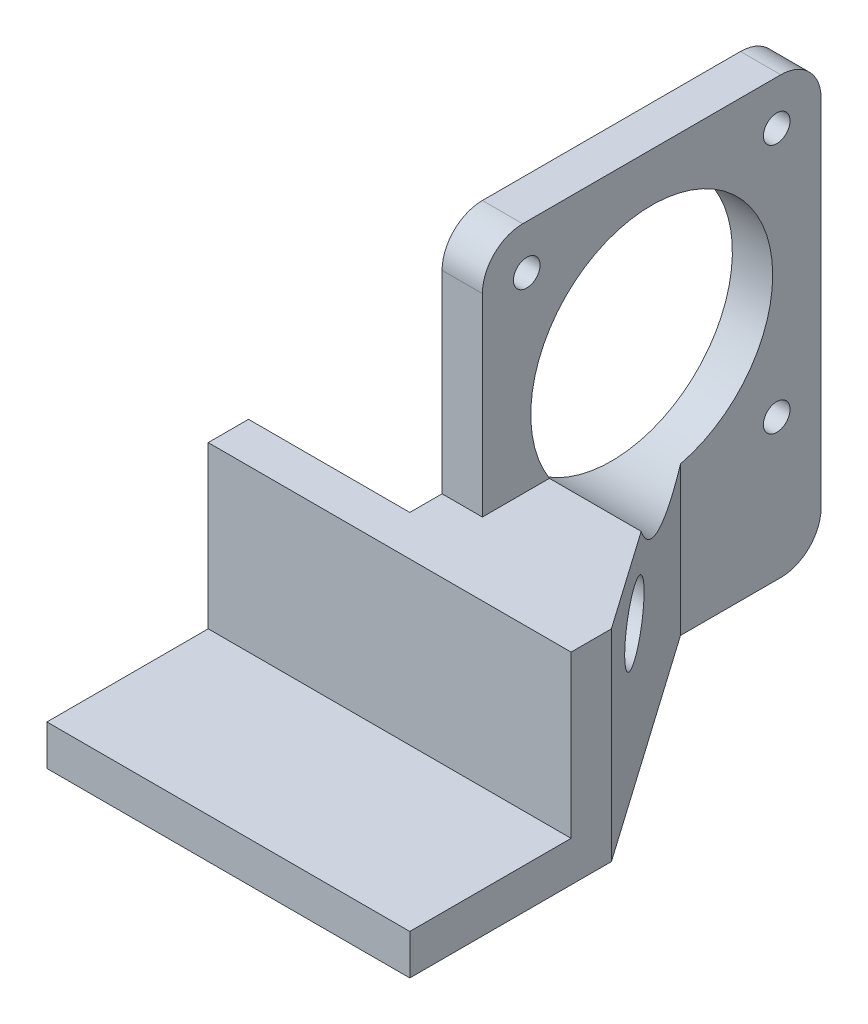
ISO-10303-21;
HEADER;
FILE_DESCRIPTION(('STEP AP214'),'2;1');
FILE_NAME('part.step','',(''),(''),'','','');
FILE_SCHEMA(('AUTOMOTIVE_DESIGN { 1 0 10303 214 1 1 1 1 }'));
ENDSEC;
DATA;
#1=APPLICATION_CONTEXT('core data for automotive mechanical design processes');
#2=APPLICATION_PROTOCOL_DEFINITION('international standard','automotive_design',2000,#1);
#3=PRODUCT_CONTEXT('',#1,'mechanical');
#4=PRODUCT('Part','Part','',(#3));
#5=PRODUCT_RELATED_PRODUCT_CATEGORY('part','',(#4));
#6=PRODUCT_DEFINITION_FORMATION('','',#4);
#7=PRODUCT_DEFINITION_CONTEXT('part definition',#1,'design');
#8=PRODUCT_DEFINITION('design','',#6,#7);
#9=PRODUCT_DEFINITION_SHAPE('','',#8);
#10=(LENGTH_UNIT() NAMED_UNIT(*) SI_UNIT(.MILLI.,.METRE.));
#11=(NAMED_UNIT(*) PLANE_ANGLE_UNIT() SI_UNIT($,.RADIAN.));
#12=(NAMED_UNIT(*) SI_UNIT($,.STERADIAN.) SOLID_ANGLE_UNIT());
#13=UNCERTAINTY_MEASURE_WITH_UNIT(LENGTH_MEASURE(1.E-05),#10,'distance_accuracy_value','');
#14=(GEOMETRIC_REPRESENTATION_CONTEXT(3) GLOBAL_UNCERTAINTY_ASSIGNED_CONTEXT((#13)) GLOBAL_UNIT_ASSIGNED_CONTEXT((#10,
#11,#12)) REPRESENTATION_CONTEXT('',''));
#15=CARTESIAN_POINT('',(0.,0.,0.));
#16=DIRECTION('',(0.,0.,1.));
#17=DIRECTION('',(1.,0.,0.));
#18=AXIS2_PLACEMENT_3D('',#15,#16,#17);
#19=CARTESIAN_POINT('',(45.,17.5,-9.49999999999999));
#20=DIRECTION('',(-1.,0.,0.));
#21=DIRECTION('',(0.,-1.,0.));
#22=AXIS2_PLACEMENT_3D('',#19,#20,#21);
#23=CYLINDRICAL_SURFACE('',#22,1.65);
#24=CARTESIAN_POINT('',(20.,17.5,-9.49999999999999));
#25=DIRECTION('',(-1.,0.,0.));
#26=DIRECTION('',(0.,-1.,0.));
#27=AXIS2_PLACEMENT_3D('',#24,#25,#26);
#28=CIRCLE('',#27,1.65);
#29=CARTESIAN_POINT('',(20.,15.85,-9.49999999999999));
#30=VERTEX_POINT('',#29);
#31=EDGE_CURVE('E424',#30,#30,#28,.T.);
#32=ORIENTED_EDGE('',*,*,#31,.T.);
#33=EDGE_LOOP('',(#32));
#34=FACE_BOUND('',#33,.T.);
#35=CARTESIAN_POINT('',(25.,17.5,-9.49999999999999));
#36=DIRECTION('',(1.,0.,0.));
#37=DIRECTION('',(0.,1.,0.));
#38=AXIS2_PLACEMENT_3D('',#35,#36,#37);
#39=CIRCLE('',#38,1.65);
#40=CARTESIAN_POINT('',(25.,19.15,-9.49999999999999));
#41=VERTEX_POINT('',#40);
#42=EDGE_CURVE('E239',#41,#41,#39,.F.);
#43=ORIENTED_EDGE('',*,*,#42,.F.);
#44=EDGE_LOOP('',(#43));
#45=FACE_BOUND('',#44,.T.);
#46=ADVANCED_FACE('F41',(#34,#45),#23,.F.);
#47=CARTESIAN_POINT('',(0.,25.,5.));
#48=DIRECTION('',(0.,-1.,0.));
#49=DIRECTION('',(0.,0.,-1.));
#50=AXIS2_PLACEMENT_3D('',#47,#48,#49);
#51=PLANE('',#50);
#52=DIRECTION('',(1.,0.,0.));
#53=VECTOR('',#52,1.);
#54=CARTESIAN_POINT('',(0.,25.,0.));
#55=LINE('',#54,#53);
#56=CARTESIAN_POINT('',(0.,25.,0.));
#57=VERTEX_POINT('',#56);
#58=CARTESIAN_POINT('',(20.,25.,0.));
#59=VERTEX_POINT('',#58);
#60=EDGE_CURVE('E364',#57,#59,#55,.T.);
#61=ORIENTED_EDGE('',*,*,#60,.F.);
#62=DIRECTION('',(0.,0.,-1.));
#63=VECTOR('',#62,1.);
#64=CARTESIAN_POINT('',(0.,25.,5.));
#65=LINE('',#64,#63);
#66=CARTESIAN_POINT('',(0.,25.,5.));
#67=VERTEX_POINT('',#66);
#68=EDGE_CURVE('E200',#67,#57,#65,.T.);
#69=ORIENTED_EDGE('',*,*,#68,.F.);
#70=DIRECTION('',(-1.,0.,0.));
#71=VECTOR('',#70,1.);
#72=CARTESIAN_POINT('',(0.,25.,5.));
#73=LINE('',#72,#71);
#74=CARTESIAN_POINT('',(45.,25.,5.));
#75=VERTEX_POINT('',#74);
#76=EDGE_CURVE('E207',#75,#67,#73,.T.);
#77=ORIENTED_EDGE('',*,*,#76,.F.);
#78=DIRECTION('',(0.,0.,-1.));
#79=VECTOR('',#78,1.);
#80=CARTESIAN_POINT('',(45.,25.,5.));
#81=LINE('',#80,#79);
#82=CARTESIAN_POINT('',(45.,25.,0.));
#83=VERTEX_POINT('',#82);
#84=EDGE_CURVE('E212',#75,#83,#81,.T.);
#85=ORIENTED_EDGE('',*,*,#84,.T.);
#86=DIRECTION('',(-0.573576436351042,0.,-0.819152044288995));
#87=VECTOR('',#86,1.);
#88=CARTESIAN_POINT('',(32.5446847767925,25.,-17.7880336093686));
#89=LINE('',#88,#87);
#90=CARTESIAN_POINT('',(36.3794491877384,25.,-12.3114224595505));
#91=VERTEX_POINT('',#90);
#92=EDGE_CURVE('E230',#83,#91,#89,.T.);
#93=ORIENTED_EDGE('',*,*,#92,.T.);
#94=DIRECTION('',(1.,0.,0.));
#95=VECTOR('',#94,1.);
#96=CARTESIAN_POINT('',(0.,25.,-12.3114224595505));
#97=LINE('',#96,#95);
#98=CARTESIAN_POINT('',(25.,25.,-12.3114224595505));
#99=VERTEX_POINT('',#98);
#100=EDGE_CURVE('E306',#91,#99,#97,.F.);
#101=ORIENTED_EDGE('',*,*,#100,.T.);
#102=DIRECTION('',(0.,0.,-1.));
#103=VECTOR('',#102,1.);
#104=CARTESIAN_POINT('',(25.,25.,-46.));
#105=LINE('',#104,#103);
#106=CARTESIAN_POINT('',(25.,25.,-4.));
#107=VERTEX_POINT('',#106);
#108=EDGE_CURVE('E298',#107,#99,#105,.T.);
#109=ORIENTED_EDGE('',*,*,#108,.F.);
#110=DIRECTION('',(1.,0.,0.));
#111=VECTOR('',#110,1.);
#112=CARTESIAN_POINT('',(20.,25.,-4.));
#113=LINE('',#112,#111);
#114=CARTESIAN_POINT('',(20.,25.,-4.));
#115=VERTEX_POINT('',#114);
#116=EDGE_CURVE('E302',#115,#107,#113,.T.);
#117=ORIENTED_EDGE('',*,*,#116,.F.);
#118=DIRECTION('',(0.,0.,-1.));
#119=VECTOR('',#118,1.);
#120=CARTESIAN_POINT('',(20.,25.,5.));
#121=LINE('',#120,#119);
#122=EDGE_CURVE('E185',#59,#115,#121,.T.);
#123=ORIENTED_EDGE('',*,*,#122,.F.);
#124=EDGE_LOOP('',(#61,#69,#77,#85,#93,#101,#109,#117,#123));
#125=FACE_BOUND('',#124,.T.);
#126=ADVANCED_FACE('F362',(#125),#51,.F.);
#127=CARTESIAN_POINT('',(20.,25.,-28.5629601348426));
#128=DIRECTION('',(0.819152044288995,0.,0.573576436351042));
#129=DIRECTION('',(0.,1.,0.));
#130=AXIS2_PLACEMENT_3D('',#127,#128,#129);
#131=PLANE('',#130);
#132=DIRECTION('',(-0.573576436351042,0.,0.819152044288995));
#133=VECTOR('',#132,1.);
#134=CARTESIAN_POINT('',(20.,10.,-28.5629601348426));
#135=LINE('',#134,#133);
#136=CARTESIAN_POINT('',(20.,10.,-28.5629601348426));
#137=VERTEX_POINT('',#136);
#138=CARTESIAN_POINT('',(0.,10.,0.));
#139=VERTEX_POINT('',#138);
#140=EDGE_CURVE('E163',#137,#139,#135,.T.);
#141=ORIENTED_EDGE('',*,*,#140,.F.);
#142=DIRECTION('',(0.,1.,0.));
#143=VECTOR('',#142,1.);
#144=CARTESIAN_POINT('',(20.,25.,-28.5629601348426));
#145=LINE('',#144,#143);
#146=CARTESIAN_POINT('',(20.,0.,-28.5629601348426));
#147=VERTEX_POINT('',#146);
#148=EDGE_CURVE('E234',#147,#137,#145,.T.);
#149=ORIENTED_EDGE('',*,*,#148,.F.);
#150=DIRECTION('',(0.573576436351042,0.,-0.819152044288995));
#151=VECTOR('',#150,1.);
#152=CARTESIAN_POINT('',(-2.34923155196476,0.,3.3550503583142));
#153=LINE('',#152,#151);
#154=CARTESIAN_POINT('',(0.,0.,0.));
#155=VERTEX_POINT('',#154);
#156=EDGE_CURVE('E175',#155,#147,#153,.T.);
#157=ORIENTED_EDGE('',*,*,#156,.F.);
#158=DIRECTION('',(0.,-1.,0.));
#159=VECTOR('',#158,1.);
#160=CARTESIAN_POINT('',(0.,0.,0.));
#161=LINE('',#160,#159);
#162=EDGE_CURVE('E188',#139,#155,#161,.T.);
#163=ORIENTED_EDGE('',*,*,#162,.F.);
#164=EDGE_LOOP('',(#141,#149,#157,#163));
#165=FACE_BOUND('',#164,.T.);
#166=ADVANCED_FACE('F189',(#165),#131,.F.);
#167=CARTESIAN_POINT('',(0.,33.,-25.));
#168=DIRECTION('',(1.,0.,0.));
#169=DIRECTION('',(0.,0.,-1.));
#170=AXIS2_PLACEMENT_3D('',#167,#168,#169);
#171=CYLINDRICAL_SURFACE('',#170,15.);
#172=CARTESIAN_POINT('',(27.4948115447574,33.,-25.));
#173=DIRECTION('',(-0.819152044288995,0.,0.573576436351041));
#174=DIRECTION('',(0.573576436351042,0.,0.819152044288995));
#175=AXIS2_PLACEMENT_3D('',#172,#173,#174);
#176=ELLIPSE('',#175,18.3116188314218,15.);
#177=CARTESIAN_POINT('',(25.,18.4292994307919,-28.5629601348425));
#178=VERTEX_POINT('',#177);
#179=EDGE_CURVE('E381',#178,#91,#176,.T.);
#180=ORIENTED_EDGE('',*,*,#179,.F.);
#181=CARTESIAN_POINT('',(25.,33.,-25.));
#182=DIRECTION('',(-1.,0.,0.));
#183=DIRECTION('',(0.,-1.,0.));
#184=AXIS2_PLACEMENT_3D('',#181,#182,#183);
#185=CIRCLE('',#184,15.);
#186=EDGE_CURVE('E385',#99,#178,#185,.T.);
#187=ORIENTED_EDGE('',*,*,#186,.F.);
#188=ORIENTED_EDGE('',*,*,#100,.F.);
#189=EDGE_LOOP('',(#180,#187,#188));
#190=FACE_BOUND('',#189,.T.);
#191=CARTESIAN_POINT('',(20.,33.,-25.));
#192=DIRECTION('',(1.,0.,0.));
#193=DIRECTION('',(0.,1.,0.));
#194=AXIS2_PLACEMENT_3D('',#191,#192,#193);
#195=CIRCLE('',#194,15.);
#196=CARTESIAN_POINT('',(20.,48.,-25.));
#197=VERTEX_POINT('',#196);
#198=EDGE_CURVE('E386',#197,#197,#195,.T.);
#199=ORIENTED_EDGE('',*,*,#198,.F.);
#200=EDGE_LOOP('',(#199));
#201=FACE_BOUND('',#200,.T.);
#202=ADVANCED_FACE('F481',(#190,#201),#171,.F.);
#203=CARTESIAN_POINT('',(0.,0.,5.));
#204=DIRECTION('',(0.,0.,-1.));
#205=DIRECTION('',(-1.,0.,0.));
#206=AXIS2_PLACEMENT_3D('',#203,#204,#205);
#207=PLANE('',#206);
#208=DIRECTION('',(-1.,0.,0.));
#209=VECTOR('',#208,1.);
#210=CARTESIAN_POINT('',(45.,5.,5.));
#211=LINE('',#210,#209);
#212=CARTESIAN_POINT('',(45.,5.,5.));
#213=VERTEX_POINT('',#212);
#214=CARTESIAN_POINT('',(0.,4.99999999999999,5.));
#215=VERTEX_POINT('',#214);
#216=EDGE_CURVE('E312',#213,#215,#211,.T.);
#217=ORIENTED_EDGE('',*,*,#216,.F.);
#218=DIRECTION('',(0.,1.,0.));
#219=VECTOR('',#218,1.);
#220=CARTESIAN_POINT('',(45.,0.,5.));
#221=LINE('',#220,#219);
#222=EDGE_CURVE('E353',#213,#75,#221,.T.);
#223=ORIENTED_EDGE('',*,*,#222,.T.);
#224=ORIENTED_EDGE('',*,*,#76,.T.);
#225=DIRECTION('',(0.,-1.,0.));
#226=VECTOR('',#225,1.);
#227=CARTESIAN_POINT('',(0.,0.,5.));
#228=LINE('',#227,#226);
#229=EDGE_CURVE('E204',#67,#215,#228,.T.);
#230=ORIENTED_EDGE('',*,*,#229,.T.);
#231=EDGE_LOOP('',(#217,#223,#224,#230));
#232=FACE_BOUND('',#231,.T.);
#233=ADVANCED_FACE('F360',(#232),#207,.F.);
#234=CARTESIAN_POINT('',(0.,0.,5.));
#235=DIRECTION('',(1.,0.,0.));
#236=DIRECTION('',(0.,1.,0.));
#237=AXIS2_PLACEMENT_3D('',#234,#235,#236);
#238=PLANE('',#237);
#239=EDGE_CURVE('E180',#57,#139,#161,.T.);
#240=ORIENTED_EDGE('',*,*,#239,.T.);
#241=ORIENTED_EDGE('',*,*,#162,.T.);
#242=DIRECTION('',(0.,0.,-1.));
#243=VECTOR('',#242,1.);
#244=CARTESIAN_POINT('',(0.,0.,5.));
#245=LINE('',#244,#243);
#246=CARTESIAN_POINT('',(0.,0.,25.));
#247=VERTEX_POINT('',#246);
#248=EDGE_CURVE('E220',#247,#155,#245,.T.);
#249=ORIENTED_EDGE('',*,*,#248,.F.);
#250=DIRECTION('',(0.,-1.,0.));
#251=VECTOR('',#250,1.);
#252=CARTESIAN_POINT('',(0.,0.,25.));
#253=LINE('',#252,#251);
#254=CARTESIAN_POINT('',(0.,4.99999999999999,25.));
#255=VERTEX_POINT('',#254);
#256=EDGE_CURVE('E320',#255,#247,#253,.T.);
#257=ORIENTED_EDGE('',*,*,#256,.F.);
#258=DIRECTION('',(0.,0.,-1.));
#259=VECTOR('',#258,1.);
#260=CARTESIAN_POINT('',(0.,4.99999999999999,25.));
#261=LINE('',#260,#259);
#262=EDGE_CURVE('E328',#255,#215,#261,.T.);
#263=ORIENTED_EDGE('',*,*,#262,.T.);
#264=ORIENTED_EDGE('',*,*,#229,.F.);
#265=ORIENTED_EDGE('',*,*,#68,.T.);
#266=EDGE_LOOP('',(#240,#241,#249,#257,#263,#264,#265));
#267=FACE_BOUND('',#266,.T.);
#268=ADVANCED_FACE('F197',(#267),#238,.F.);
#269=CARTESIAN_POINT('',(0.,0.,5.));
#270=DIRECTION('',(0.,1.,0.));
#271=DIRECTION('',(0.,0.,1.));
#272=AXIS2_PLACEMENT_3D('',#269,#270,#271);
#273=PLANE('',#272);
#274=DIRECTION('',(0.,0.,1.));
#275=VECTOR('',#274,1.);
#276=CARTESIAN_POINT('',(20.,0.,-46.));
#277=LINE('',#276,#275);
#278=CARTESIAN_POINT('',(20.,0.,-41.));
#279=VERTEX_POINT('',#278);
#280=EDGE_CURVE('E347',#279,#147,#277,.T.);
#281=ORIENTED_EDGE('',*,*,#280,.F.);
#282=DIRECTION('',(-1.,0.,0.));
#283=VECTOR('',#282,1.);
#284=CARTESIAN_POINT('',(25.,0.,-41.));
#285=LINE('',#284,#283);
#286=CARTESIAN_POINT('',(25.,0.,-41.));
#287=VERTEX_POINT('',#286);
#288=EDGE_CURVE('E264',#279,#287,#285,.F.);
#289=ORIENTED_EDGE('',*,*,#288,.T.);
#290=DIRECTION('',(0.,0.,1.));
#291=VECTOR('',#290,1.);
#292=CARTESIAN_POINT('',(25.,0.,-46.));
#293=LINE('',#292,#291);
#294=CARTESIAN_POINT('',(25.,0.,-28.5629601348425));
#295=VERTEX_POINT('',#294);
#296=EDGE_CURVE('E194',#287,#295,#293,.T.);
#297=ORIENTED_EDGE('',*,*,#296,.T.);
#298=DIRECTION('',(0.573576436351042,0.,0.819152044288995));
#299=VECTOR('',#298,1.);
#300=CARTESIAN_POINT('',(32.5446847767925,0.,-17.7880336093686));
#301=LINE('',#300,#299);
#302=CARTESIAN_POINT('',(45.,0.,0.));
#303=VERTEX_POINT('',#302);
#304=EDGE_CURVE('E227',#295,#303,#301,.T.);
#305=ORIENTED_EDGE('',*,*,#304,.T.);
#306=DIRECTION('',(0.,0.,-1.));
#307=VECTOR('',#306,1.);
#308=CARTESIAN_POINT('',(45.,0.,5.));
#309=LINE('',#308,#307);
#310=CARTESIAN_POINT('',(45.,0.,25.));
#311=VERTEX_POINT('',#310);
#312=EDGE_CURVE('E216',#311,#303,#309,.T.);
#313=ORIENTED_EDGE('',*,*,#312,.F.);
#314=DIRECTION('',(1.,0.,0.));
#315=VECTOR('',#314,1.);
#316=CARTESIAN_POINT('',(45.,0.,25.));
#317=LINE('',#316,#315);
#318=EDGE_CURVE('E324',#247,#311,#317,.T.);
#319=ORIENTED_EDGE('',*,*,#318,.F.);
#320=ORIENTED_EDGE('',*,*,#248,.T.);
#321=ORIENTED_EDGE('',*,*,#156,.T.);
#322=EDGE_LOOP('',(#281,#289,#297,#305,#313,#319,#320,#321));
#323=FACE_BOUND('',#322,.T.);
#324=ADVANCED_FACE('F503',(#323),#273,.F.);
#325=CARTESIAN_POINT('',(45.,0.,5.));
#326=DIRECTION('',(-1.,0.,0.));
#327=DIRECTION('',(0.,-1.,0.));
#328=AXIS2_PLACEMENT_3D('',#325,#326,#327);
#329=PLANE('',#328);
#330=DIRECTION('',(0.,1.,0.));
#331=VECTOR('',#330,1.);
#332=CARTESIAN_POINT('',(45.,0.,0.));
#333=LINE('',#332,#331);
#334=EDGE_CURVE('E202',#303,#83,#333,.T.);
#335=ORIENTED_EDGE('',*,*,#334,.T.);
#336=ORIENTED_EDGE('',*,*,#84,.F.);
#337=ORIENTED_EDGE('',*,*,#222,.F.);
#338=DIRECTION('',(0.,0.,-1.));
#339=VECTOR('',#338,1.);
#340=CARTESIAN_POINT('',(45.,5.,25.));
#341=LINE('',#340,#339);
#342=CARTESIAN_POINT('',(45.,5.,25.));
#343=VERTEX_POINT('',#342);
#344=EDGE_CURVE('E335',#343,#213,#341,.T.);
#345=ORIENTED_EDGE('',*,*,#344,.F.);
#346=DIRECTION('',(0.,1.,0.));
#347=VECTOR('',#346,1.);
#348=CARTESIAN_POINT('',(45.,0.,25.));
#349=LINE('',#348,#347);
#350=EDGE_CURVE('E313',#311,#343,#349,.T.);
#351=ORIENTED_EDGE('',*,*,#350,.F.);
#352=ORIENTED_EDGE('',*,*,#312,.T.);
#353=EDGE_LOOP('',(#335,#336,#337,#345,#351,#352));
#354=FACE_BOUND('',#353,.T.);
#355=ADVANCED_FACE('F371',(#354),#329,.F.);
#356=CARTESIAN_POINT('',(25.,25.,-46.));
#357=DIRECTION('',(-1.,0.,0.));
#358=DIRECTION('',(0.,-1.,0.));
#359=AXIS2_PLACEMENT_3D('',#356,#357,#358);
#360=PLANE('',#359);
#361=CARTESIAN_POINT('',(25.,17.5,-40.5));
#362=DIRECTION('',(-1.,0.,0.));
#363=DIRECTION('',(0.,-1.,0.));
#364=AXIS2_PLACEMENT_3D('',#361,#362,#363);
#365=CIRCLE('',#364,1.65);
#366=CARTESIAN_POINT('',(25.,15.85,-40.5));
#367=VERTEX_POINT('',#366);
#368=EDGE_CURVE('E404',#367,#367,#365,.T.);
#369=ORIENTED_EDGE('',*,*,#368,.T.);
#370=EDGE_LOOP('',(#369));
#371=FACE_BOUND('',#370,.T.);
#372=CARTESIAN_POINT('',(25.,48.5,-9.49999999999999));
#373=DIRECTION('',(-1.,0.,0.));
#374=DIRECTION('',(0.,-1.,0.));
#375=AXIS2_PLACEMENT_3D('',#372,#373,#374);
#376=CIRCLE('',#375,1.65);
#377=CARTESIAN_POINT('',(25.,46.85,-9.49999999999999));
#378=VERTEX_POINT('',#377);
#379=EDGE_CURVE('E408',#378,#378,#376,.T.);
#380=ORIENTED_EDGE('',*,*,#379,.T.);
#381=EDGE_LOOP('',(#380));
#382=FACE_BOUND('',#381,.T.);
#383=CARTESIAN_POINT('',(25.,48.5,-40.5));
#384=DIRECTION('',(-1.,0.,0.));
#385=DIRECTION('',(0.,-1.,0.));
#386=AXIS2_PLACEMENT_3D('',#383,#384,#385);
#387=CIRCLE('',#386,1.65);
#388=CARTESIAN_POINT('',(25.,46.85,-40.5));
#389=VERTEX_POINT('',#388);
#390=EDGE_CURVE('E412',#389,#389,#387,.T.);
#391=ORIENTED_EDGE('',*,*,#390,.T.);
#392=EDGE_LOOP('',(#391));
#393=FACE_BOUND('',#392,.T.);
#394=ORIENTED_EDGE('',*,*,#296,.F.);
#395=CARTESIAN_POINT('',(25.,5.,-41.));
#396=DIRECTION('',(-1.,0.,0.));
#397=DIRECTION('',(0.,-1.,0.));
#398=AXIS2_PLACEMENT_3D('',#395,#396,#397);
#399=CIRCLE('',#398,5.);
#400=CARTESIAN_POINT('',(25.,5.,-46.));
#401=VERTEX_POINT('',#400);
#402=EDGE_CURVE('E271',#287,#401,#399,.F.);
#403=ORIENTED_EDGE('',*,*,#402,.T.);
#404=DIRECTION('',(0.,-1.,0.));
#405=VECTOR('',#404,1.);
#406=CARTESIAN_POINT('',(25.,25.,-46.));
#407=LINE('',#406,#405);
#408=CARTESIAN_POINT('',(25.,49.,-46.));
#409=VERTEX_POINT('',#408);
#410=EDGE_CURVE('E339',#409,#401,#407,.T.);
#411=ORIENTED_EDGE('',*,*,#410,.F.);
#412=CARTESIAN_POINT('',(25.,49.,-41.));
#413=DIRECTION('',(-1.,0.,0.));
#414=DIRECTION('',(0.,-1.,0.));
#415=AXIS2_PLACEMENT_3D('',#412,#413,#414);
#416=CIRCLE('',#415,5.);
#417=CARTESIAN_POINT('',(25.,54.,-41.));
#418=VERTEX_POINT('',#417);
#419=EDGE_CURVE('E63',#409,#418,#416,.F.);
#420=ORIENTED_EDGE('',*,*,#419,.T.);
#421=DIRECTION('',(0.,0.,-1.));
#422=VECTOR('',#421,1.);
#423=CARTESIAN_POINT('',(25.,54.,-46.));
#424=LINE('',#423,#422);
#425=CARTESIAN_POINT('',(25.,54.,-9.00000000000001));
#426=VERTEX_POINT('',#425);
#427=EDGE_CURVE('E283',#426,#418,#424,.T.);
#428=ORIENTED_EDGE('',*,*,#427,.F.);
#429=CARTESIAN_POINT('',(25.,49.,-9.));
#430=DIRECTION('',(-1.,0.,0.));
#431=DIRECTION('',(0.,-1.,0.));
#432=AXIS2_PLACEMENT_3D('',#429,#430,#431);
#433=CIRCLE('',#432,5.);
#434=CARTESIAN_POINT('',(25.,49.,-4.));
#435=VERTEX_POINT('',#434);
#436=EDGE_CURVE('E57',#426,#435,#433,.F.);
#437=ORIENTED_EDGE('',*,*,#436,.T.);
#438=DIRECTION('',(0.,-1.,0.));
#439=VECTOR('',#438,1.);
#440=CARTESIAN_POINT('',(25.,54.,-4.));
#441=LINE('',#440,#439);
#442=EDGE_CURVE('E292',#435,#107,#441,.T.);
#443=ORIENTED_EDGE('',*,*,#442,.T.);
#444=ORIENTED_EDGE('',*,*,#108,.T.);
#445=ORIENTED_EDGE('',*,*,#186,.T.);
#446=DIRECTION('',(0.,-1.,0.));
#447=VECTOR('',#446,1.);
#448=CARTESIAN_POINT('',(25.,25.,-28.5629601348425));
#449=LINE('',#448,#447);
#450=EDGE_CURVE('E223',#178,#295,#449,.T.);
#451=ORIENTED_EDGE('',*,*,#450,.T.);
#452=EDGE_LOOP('',(#394,#403,#411,#420,#428,#437,#443,#444,#445,#451));
#453=FACE_BOUND('',#452,.T.);
#454=ADVANCED_FACE('F290',(#371,#382,#393,#453),#360,.F.);
#455=CARTESIAN_POINT('',(20.,25.,-46.));
#456=DIRECTION('',(1.,0.,0.));
#457=DIRECTION('',(0.,1.,0.));
#458=AXIS2_PLACEMENT_3D('',#455,#456,#457);
#459=PLANE('',#458);
#460=CARTESIAN_POINT('',(20.,17.5,-40.5));
#461=DIRECTION('',(-1.,0.,0.));
#462=DIRECTION('',(0.,-1.,0.));
#463=AXIS2_PLACEMENT_3D('',#460,#461,#462);
#464=CIRCLE('',#463,1.65);
#465=CARTESIAN_POINT('',(20.,15.85,-40.5));
#466=VERTEX_POINT('',#465);
#467=EDGE_CURVE('E248',#466,#466,#464,.T.);
#468=ORIENTED_EDGE('',*,*,#467,.F.);
#469=EDGE_LOOP('',(#468));
#470=FACE_BOUND('',#469,.T.);
#471=ORIENTED_EDGE('',*,*,#31,.F.);
#472=EDGE_LOOP('',(#471));
#473=FACE_BOUND('',#472,.T.);
#474=CARTESIAN_POINT('',(20.,48.5,-9.49999999999999));
#475=DIRECTION('',(-1.,0.,0.));
#476=DIRECTION('',(0.,-1.,0.));
#477=AXIS2_PLACEMENT_3D('',#474,#475,#476);
#478=CIRCLE('',#477,1.65);
#479=CARTESIAN_POINT('',(20.,46.85,-9.49999999999999));
#480=VERTEX_POINT('',#479);
#481=EDGE_CURVE('E420',#480,#480,#478,.T.);
#482=ORIENTED_EDGE('',*,*,#481,.F.);
#483=EDGE_LOOP('',(#482));
#484=FACE_BOUND('',#483,.T.);
#485=CARTESIAN_POINT('',(20.,48.5,-40.5));
#486=DIRECTION('',(-1.,0.,0.));
#487=DIRECTION('',(0.,-1.,0.));
#488=AXIS2_PLACEMENT_3D('',#485,#486,#487);
#489=CIRCLE('',#488,1.65);
#490=CARTESIAN_POINT('',(20.,46.85,-40.5));
#491=VERTEX_POINT('',#490);
#492=EDGE_CURVE('E416',#491,#491,#489,.T.);
#493=ORIENTED_EDGE('',*,*,#492,.F.);
#494=EDGE_LOOP('',(#493));
#495=FACE_BOUND('',#494,.T.);
#496=DIRECTION('',(0.,1.,0.));
#497=VECTOR('',#496,1.);
#498=CARTESIAN_POINT('',(20.,25.,-46.));
#499=LINE('',#498,#497);
#500=CARTESIAN_POINT('',(20.,5.,-46.));
#501=VERTEX_POINT('',#500);
#502=CARTESIAN_POINT('',(20.,49.,-46.));
#503=VERTEX_POINT('',#502);
#504=EDGE_CURVE('E343',#501,#503,#499,.T.);
#505=ORIENTED_EDGE('',*,*,#504,.F.);
#506=CARTESIAN_POINT('',(20.,5.,-41.));
#507=DIRECTION('',(1.,0.,0.));
#508=DIRECTION('',(0.,1.,0.));
#509=AXIS2_PLACEMENT_3D('',#506,#507,#508);
#510=CIRCLE('',#509,5.);
#511=EDGE_CURVE('E261',#501,#279,#510,.F.);
#512=ORIENTED_EDGE('',*,*,#511,.T.);
#513=ORIENTED_EDGE('',*,*,#280,.T.);
#514=ORIENTED_EDGE('',*,*,#148,.T.);
#515=DIRECTION('',(0.,0.,1.));
#516=VECTOR('',#515,1.);
#517=CARTESIAN_POINT('',(20.,10.,-46.));
#518=LINE('',#517,#516);
#519=CARTESIAN_POINT('',(20.,10.,0.));
#520=VERTEX_POINT('',#519);
#521=EDGE_CURVE('E168',#137,#520,#518,.T.);
#522=ORIENTED_EDGE('',*,*,#521,.T.);
#523=DIRECTION('',(0.,1.,0.));
#524=VECTOR('',#523,1.);
#525=CARTESIAN_POINT('',(20.,54.,0.));
#526=LINE('',#525,#524);
#527=EDGE_CURVE('E183',#520,#59,#526,.T.);
#528=ORIENTED_EDGE('',*,*,#527,.T.);
#529=ORIENTED_EDGE('',*,*,#122,.T.);
#530=DIRECTION('',(0.,-1.,0.));
#531=VECTOR('',#530,1.);
#532=CARTESIAN_POINT('',(20.,54.,-4.));
#533=LINE('',#532,#531);
#534=CARTESIAN_POINT('',(20.,49.,-4.));
#535=VERTEX_POINT('',#534);
#536=EDGE_CURVE('E296',#535,#115,#533,.T.);
#537=ORIENTED_EDGE('',*,*,#536,.F.);
#538=CARTESIAN_POINT('',(20.,49.,-9.));
#539=DIRECTION('',(1.,0.,0.));
#540=DIRECTION('',(0.,1.,0.));
#541=AXIS2_PLACEMENT_3D('',#538,#539,#540);
#542=CIRCLE('',#541,5.);
#543=CARTESIAN_POINT('',(20.,54.,-9.00000000000001));
#544=VERTEX_POINT('',#543);
#545=EDGE_CURVE('E258',#535,#544,#542,.F.);
#546=ORIENTED_EDGE('',*,*,#545,.T.);
#547=DIRECTION('',(0.,0.,1.));
#548=VECTOR('',#547,1.);
#549=CARTESIAN_POINT('',(20.,54.,-46.));
#550=LINE('',#549,#548);
#551=CARTESIAN_POINT('',(20.,54.,-41.));
#552=VERTEX_POINT('',#551);
#553=EDGE_CURVE('E286',#552,#544,#550,.T.);
#554=ORIENTED_EDGE('',*,*,#553,.F.);
#555=CARTESIAN_POINT('',(20.,49.,-41.));
#556=DIRECTION('',(1.,0.,0.));
#557=DIRECTION('',(0.,1.,0.));
#558=AXIS2_PLACEMENT_3D('',#555,#556,#557);
#559=CIRCLE('',#558,5.);
#560=EDGE_CURVE('E255',#552,#503,#559,.F.);
#561=ORIENTED_EDGE('',*,*,#560,.T.);
#562=EDGE_LOOP('',(#505,#512,#513,#514,#522,#528,#529,#537,#546,#554,#561));
#563=FACE_BOUND('',#562,.T.);
#564=ORIENTED_EDGE('',*,*,#198,.T.);
#565=EDGE_LOOP('',(#564));
#566=FACE_BOUND('',#565,.T.);
#567=ADVANCED_FACE('F491',(#470,#473,#484,#495,#563,#566),#459,.F.);
#568=CARTESIAN_POINT('',(0.,0.,-46.));
#569=DIRECTION('',(0.,0.,-1.));
#570=DIRECTION('',(-1.,0.,0.));
#571=AXIS2_PLACEMENT_3D('',#568,#569,#570);
#572=PLANE('',#571);
#573=ORIENTED_EDGE('',*,*,#410,.T.);
#574=DIRECTION('',(-1.,0.,0.));
#575=VECTOR('',#574,1.);
#576=CARTESIAN_POINT('',(20.,5.,-46.));
#577=LINE('',#576,#575);
#578=EDGE_CURVE('E251',#401,#501,#577,.T.);
#579=ORIENTED_EDGE('',*,*,#578,.T.);
#580=ORIENTED_EDGE('',*,*,#504,.T.);
#581=DIRECTION('',(-1.,0.,0.));
#582=VECTOR('',#581,1.);
#583=CARTESIAN_POINT('',(0.,49.,-46.));
#584=LINE('',#583,#582);
#585=EDGE_CURVE('E174',#503,#409,#584,.F.);
#586=ORIENTED_EDGE('',*,*,#585,.T.);
#587=EDGE_LOOP('',(#573,#579,#580,#586));
#588=FACE_BOUND('',#587,.T.);
#589=ADVANCED_FACE('F488',(#588),#572,.T.);
#590=CARTESIAN_POINT('',(45.,5.,25.));
#591=DIRECTION('',(0.,-1.,0.));
#592=DIRECTION('',(1.,0.,0.));
#593=AXIS2_PLACEMENT_3D('',#590,#591,#592);
#594=PLANE('',#593);
#595=ORIENTED_EDGE('',*,*,#216,.T.);
#596=ORIENTED_EDGE('',*,*,#262,.F.);
#597=DIRECTION('',(-1.,0.,0.));
#598=VECTOR('',#597,1.);
#599=CARTESIAN_POINT('',(45.,5.,25.));
#600=LINE('',#599,#598);
#601=EDGE_CURVE('E317',#343,#255,#600,.T.);
#602=ORIENTED_EDGE('',*,*,#601,.F.);
#603=ORIENTED_EDGE('',*,*,#344,.T.);
#604=EDGE_LOOP('',(#595,#596,#602,#603));
#605=FACE_BOUND('',#604,.T.);
#606=ADVANCED_FACE('F368',(#605),#594,.F.);
#607=CARTESIAN_POINT('',(0.,0.,25.));
#608=DIRECTION('',(0.,0.,1.));
#609=DIRECTION('',(1.,0.,0.));
#610=AXIS2_PLACEMENT_3D('',#607,#608,#609);
#611=PLANE('',#610);
#612=ORIENTED_EDGE('',*,*,#350,.T.);
#613=ORIENTED_EDGE('',*,*,#601,.T.);
#614=ORIENTED_EDGE('',*,*,#256,.T.);
#615=ORIENTED_EDGE('',*,*,#318,.T.);
#616=EDGE_LOOP('',(#612,#613,#614,#615));
#617=FACE_BOUND('',#616,.T.);
#618=ADVANCED_FACE('F447',(#617),#611,.T.);
#619=CARTESIAN_POINT('',(25.,25.,-28.5629601348425));
#620=DIRECTION('',(-0.819152044288995,0.,0.573576436351041));
#621=DIRECTION('',(0.,-1.,0.));
#622=AXIS2_PLACEMENT_3D('',#619,#620,#621);
#623=PLANE('',#622);
#624=CARTESIAN_POINT('',(38.3480283870078,17.5,-9.49999999999999));
#625=DIRECTION('',(-0.819152044288995,0.,0.573576436351041));
#626=DIRECTION('',(-0.573576436351042,0.,-0.819152044288995));
#627=AXIS2_PLACEMENT_3D('',#624,#625,#626);
#628=ELLIPSE('',#627,4.88309835504581,4.);
#629=CARTESIAN_POINT('',(35.547198234169,17.5,-13.5));
#630=VERTEX_POINT('',#629);
#631=EDGE_CURVE('E243',#630,#630,#628,.F.);
#632=ORIENTED_EDGE('',*,*,#631,.F.);
#633=EDGE_LOOP('',(#632));
#634=FACE_BOUND('',#633,.T.);
#635=ORIENTED_EDGE('',*,*,#450,.F.);
#636=ORIENTED_EDGE('',*,*,#179,.T.);
#637=ORIENTED_EDGE('',*,*,#92,.F.);
#638=ORIENTED_EDGE('',*,*,#334,.F.);
#639=ORIENTED_EDGE('',*,*,#304,.F.);
#640=EDGE_LOOP('',(#635,#636,#637,#638,#639));
#641=FACE_BOUND('',#640,.T.);
#642=ADVANCED_FACE('F379',(#634,#641),#623,.F.);
#643=CARTESIAN_POINT('',(20.,54.,-4.));
#644=DIRECTION('',(0.,0.,-1.));
#645=DIRECTION('',(-1.,0.,0.));
#646=AXIS2_PLACEMENT_3D('',#643,#644,#645);
#647=PLANE('',#646);
#648=ORIENTED_EDGE('',*,*,#442,.F.);
#649=DIRECTION('',(1.,0.,0.));
#650=VECTOR('',#649,1.);
#651=CARTESIAN_POINT('',(20.,49.,-4.));
#652=LINE('',#651,#650);
#653=EDGE_CURVE('E11',#435,#535,#652,.F.);
#654=ORIENTED_EDGE('',*,*,#653,.T.);
#655=ORIENTED_EDGE('',*,*,#536,.T.);
#656=ORIENTED_EDGE('',*,*,#116,.T.);
#657=EDGE_LOOP('',(#648,#654,#655,#656));
#658=FACE_BOUND('',#657,.T.);
#659=ADVANCED_FACE('F446',(#658),#647,.F.);
#660=CARTESIAN_POINT('',(0.,54.,0.));
#661=DIRECTION('',(0.,1.,0.));
#662=DIRECTION('',(0.,0.,1.));
#663=AXIS2_PLACEMENT_3D('',#660,#661,#662);
#664=PLANE('',#663);
#665=ORIENTED_EDGE('',*,*,#553,.T.);
#666=DIRECTION('',(1.,0.,0.));
#667=VECTOR('',#666,1.);
#668=CARTESIAN_POINT('',(25.,54.,-9.));
#669=LINE('',#668,#667);
#670=EDGE_CURVE('E50',#544,#426,#669,.T.);
#671=ORIENTED_EDGE('',*,*,#670,.T.);
#672=ORIENTED_EDGE('',*,*,#427,.T.);
#673=DIRECTION('',(-1.,0.,0.));
#674=VECTOR('',#673,1.);
#675=CARTESIAN_POINT('',(0.,54.,-41.));
#676=LINE('',#675,#674);
#677=EDGE_CURVE('E274',#418,#552,#676,.T.);
#678=ORIENTED_EDGE('',*,*,#677,.T.);
#679=EDGE_LOOP('',(#665,#671,#672,#678));
#680=FACE_BOUND('',#679,.T.);
#681=ADVANCED_FACE('F282',(#680),#664,.T.);
#682=CARTESIAN_POINT('',(0.,10.,-46.));
#683=DIRECTION('',(0.,1.,0.));
#684=DIRECTION('',(-1.,0.,0.));
#685=AXIS2_PLACEMENT_3D('',#682,#683,#684);
#686=PLANE('',#685);
#687=ORIENTED_EDGE('',*,*,#140,.T.);
#688=DIRECTION('',(1.,0.,0.));
#689=VECTOR('',#688,1.);
#690=CARTESIAN_POINT('',(0.,10.,0.));
#691=LINE('',#690,#689);
#692=EDGE_CURVE('E166',#139,#520,#691,.T.);
#693=ORIENTED_EDGE('',*,*,#692,.T.);
#694=ORIENTED_EDGE('',*,*,#521,.F.);
#695=EDGE_LOOP('',(#687,#693,#694));
#696=FACE_BOUND('',#695,.T.);
#697=ADVANCED_FACE('F165',(#696),#686,.T.);
#698=CARTESIAN_POINT('',(0.,54.,0.));
#699=DIRECTION('',(0.,0.,-1.));
#700=DIRECTION('',(0.,1.,0.));
#701=AXIS2_PLACEMENT_3D('',#698,#699,#700);
#702=PLANE('',#701);
#703=ORIENTED_EDGE('',*,*,#60,.T.);
#704=ORIENTED_EDGE('',*,*,#527,.F.);
#705=ORIENTED_EDGE('',*,*,#692,.F.);
#706=ORIENTED_EDGE('',*,*,#239,.F.);
#707=EDGE_LOOP('',(#703,#704,#705,#706));
#708=FACE_BOUND('',#707,.T.);
#709=ADVANCED_FACE('F178',(#708),#702,.T.);
#710=CARTESIAN_POINT('',(45.,48.5,-40.5));
#711=DIRECTION('',(-1.,0.,0.));
#712=DIRECTION('',(0.,-1.,0.));
#713=AXIS2_PLACEMENT_3D('',#710,#711,#712);
#714=CYLINDRICAL_SURFACE('',#713,1.65);
#715=ORIENTED_EDGE('',*,*,#492,.T.);
#716=EDGE_LOOP('',(#715));
#717=FACE_BOUND('',#716,.T.);
#718=ORIENTED_EDGE('',*,*,#390,.F.);
#719=EDGE_LOOP('',(#718));
#720=FACE_BOUND('',#719,.T.);
#721=ADVANCED_FACE('F473',(#717,#720),#714,.F.);
#722=CARTESIAN_POINT('',(45.,48.5,-9.49999999999999));
#723=DIRECTION('',(-1.,0.,0.));
#724=DIRECTION('',(0.,-1.,0.));
#725=AXIS2_PLACEMENT_3D('',#722,#723,#724);
#726=CYLINDRICAL_SURFACE('',#725,1.65);
#727=ORIENTED_EDGE('',*,*,#481,.T.);
#728=EDGE_LOOP('',(#727));
#729=FACE_BOUND('',#728,.T.);
#730=ORIENTED_EDGE('',*,*,#379,.F.);
#731=EDGE_LOOP('',(#730));
#732=FACE_BOUND('',#731,.T.);
#733=ADVANCED_FACE('F469',(#729,#732),#726,.F.);
#734=CARTESIAN_POINT('',(45.,17.5,-40.5));
#735=DIRECTION('',(-1.,0.,0.));
#736=DIRECTION('',(0.,-1.,0.));
#737=AXIS2_PLACEMENT_3D('',#734,#735,#736);
#738=CYLINDRICAL_SURFACE('',#737,1.65);
#739=ORIENTED_EDGE('',*,*,#467,.T.);
#740=EDGE_LOOP('',(#739));
#741=FACE_BOUND('',#740,.T.);
#742=ORIENTED_EDGE('',*,*,#368,.F.);
#743=EDGE_LOOP('',(#742));
#744=FACE_BOUND('',#743,.T.);
#745=ADVANCED_FACE('F441',(#741,#744),#738,.F.);
#746=CARTESIAN_POINT('',(45.,17.5,-9.49999999999999));
#747=DIRECTION('',(-1.,0.,0.));
#748=DIRECTION('',(0.,-1.,0.));
#749=AXIS2_PLACEMENT_3D('',#746,#747,#748);
#750=CYLINDRICAL_SURFACE('',#749,4.);
#751=CARTESIAN_POINT('',(25.,17.5,-9.49999999999999));
#752=DIRECTION('',(1.,0.,0.));
#753=DIRECTION('',(0.,1.,0.));
#754=AXIS2_PLACEMENT_3D('',#751,#752,#753);
#755=CIRCLE('',#754,4.);
#756=CARTESIAN_POINT('',(25.,21.5,-9.49999999999999));
#757=VERTEX_POINT('',#756);
#758=EDGE_CURVE('E244',#757,#757,#755,.T.);
#759=ORIENTED_EDGE('',*,*,#758,.F.);
#760=EDGE_LOOP('',(#759));
#761=FACE_BOUND('',#760,.T.);
#762=ORIENTED_EDGE('',*,*,#631,.T.);
#763=EDGE_LOOP('',(#762));
#764=FACE_BOUND('',#763,.T.);
#765=ADVANCED_FACE('F438',(#761,#764),#750,.F.);
#766=CARTESIAN_POINT('',(25.,17.5,-9.49999999999999));
#767=DIRECTION('',(1.,0.,0.));
#768=DIRECTION('',(0.,1.,0.));
#769=AXIS2_PLACEMENT_3D('',#766,#767,#768);
#770=PLANE('',#769);
#771=ORIENTED_EDGE('',*,*,#758,.T.);
#772=EDGE_LOOP('',(#771));
#773=FACE_BOUND('',#772,.T.);
#774=ORIENTED_EDGE('',*,*,#42,.T.);
#775=EDGE_LOOP('',(#774));
#776=FACE_BOUND('',#775,.T.);
#777=ADVANCED_FACE('F435',(#773,#776),#770,.T.);
#778=CARTESIAN_POINT('',(0.,5.,-41.));
#779=DIRECTION('',(1.,0.,0.));
#780=DIRECTION('',(0.,0.,-1.));
#781=AXIS2_PLACEMENT_3D('',#778,#779,#780);
#782=CYLINDRICAL_SURFACE('',#781,5.);
#783=ORIENTED_EDGE('',*,*,#402,.F.);
#784=ORIENTED_EDGE('',*,*,#288,.F.);
#785=ORIENTED_EDGE('',*,*,#511,.F.);
#786=ORIENTED_EDGE('',*,*,#578,.F.);
#787=EDGE_LOOP('',(#783,#784,#785,#786));
#788=FACE_BOUND('',#787,.T.);
#789=ADVANCED_FACE('F607',(#788),#782,.T.);
#790=CARTESIAN_POINT('',(0.,49.,-9.));
#791=DIRECTION('',(-1.,0.,0.));
#792=DIRECTION('',(0.,0.,1.));
#793=AXIS2_PLACEMENT_3D('',#790,#791,#792);
#794=CYLINDRICAL_SURFACE('',#793,5.);
#795=ORIENTED_EDGE('',*,*,#545,.F.);
#796=ORIENTED_EDGE('',*,*,#653,.F.);
#797=ORIENTED_EDGE('',*,*,#436,.F.);
#798=ORIENTED_EDGE('',*,*,#670,.F.);
#799=EDGE_LOOP('',(#795,#796,#797,#798));
#800=FACE_BOUND('',#799,.T.);
#801=ADVANCED_FACE('F609',(#800),#794,.T.);
#802=CARTESIAN_POINT('',(0.,49.,-41.));
#803=DIRECTION('',(-1.,0.,0.));
#804=DIRECTION('',(0.,0.,1.));
#805=AXIS2_PLACEMENT_3D('',#802,#803,#804);
#806=CYLINDRICAL_SURFACE('',#805,5.);
#807=ORIENTED_EDGE('',*,*,#419,.F.);
#808=ORIENTED_EDGE('',*,*,#585,.F.);
#809=ORIENTED_EDGE('',*,*,#560,.F.);
#810=ORIENTED_EDGE('',*,*,#677,.F.);
#811=EDGE_LOOP('',(#807,#808,#809,#810));
#812=FACE_BOUND('',#811,.T.);
#813=ADVANCED_FACE('F43',(#812),#806,.T.);
#814=CLOSED_SHELL('',(#46,#126,#166,#202,#233,#268,#324,#355,#454,#567,#589,#606,#618,#642,#659,
#681,#697,#709,#721,#733,#745,#765,#777,#789,#801,#813));
#815=MANIFOLD_SOLID_BREP('B2',#814);
#816=ADVANCED_BREP_SHAPE_REPRESENTATION('',(#18,#815),#14);
#817=SHAPE_DEFINITION_REPRESENTATION(#9,#816);
ENDSEC;
END-ISO-10303-21;
